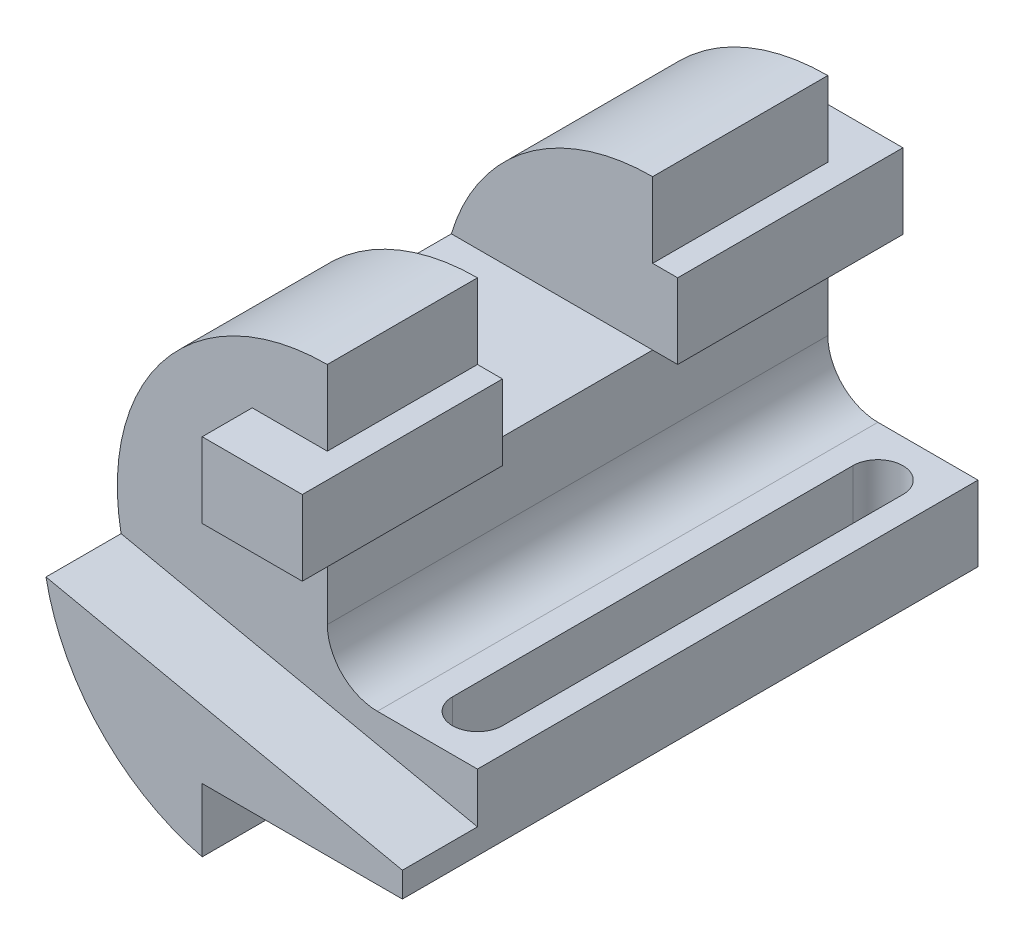
ISO-10303-21;
HEADER;
FILE_DESCRIPTION(('STEP AP214'),'2;1');
FILE_NAME('part.step','',(''),(''),'','','');
FILE_SCHEMA(('AUTOMOTIVE_DESIGN { 1 0 10303 214 1 1 1 1 }'));
ENDSEC;
DATA;
#1=APPLICATION_CONTEXT('core data for automotive mechanical design processes');
#2=APPLICATION_PROTOCOL_DEFINITION('international standard','automotive_design',2000,#1);
#3=PRODUCT_CONTEXT('',#1,'mechanical');
#4=PRODUCT('Part','Part','',(#3));
#5=PRODUCT_RELATED_PRODUCT_CATEGORY('part','',(#4));
#6=PRODUCT_DEFINITION_FORMATION('','',#4);
#7=PRODUCT_DEFINITION_CONTEXT('part definition',#1,'design');
#8=PRODUCT_DEFINITION('design','',#6,#7);
#9=PRODUCT_DEFINITION_SHAPE('','',#8);
#10=(LENGTH_UNIT() NAMED_UNIT(*) SI_UNIT(.MILLI.,.METRE.));
#11=(NAMED_UNIT(*) PLANE_ANGLE_UNIT() SI_UNIT($,.RADIAN.));
#12=(NAMED_UNIT(*) SI_UNIT($,.STERADIAN.) SOLID_ANGLE_UNIT());
#13=UNCERTAINTY_MEASURE_WITH_UNIT(LENGTH_MEASURE(1.E-05),#10,'distance_accuracy_value','');
#14=(GEOMETRIC_REPRESENTATION_CONTEXT(3) GLOBAL_UNCERTAINTY_ASSIGNED_CONTEXT((#13)) GLOBAL_UNIT_ASSIGNED_CONTEXT((#10,
#11,#12)) REPRESENTATION_CONTEXT('',''));
#15=CARTESIAN_POINT('',(0.,0.,0.));
#16=DIRECTION('',(0.,0.,1.));
#17=DIRECTION('',(1.,0.,0.));
#18=AXIS2_PLACEMENT_3D('',#15,#16,#17);
#19=CARTESIAN_POINT('',(9.99999999999992,40.7463920640612,100.));
#20=DIRECTION('',(0.,0.,1.));
#21=DIRECTION('',(1.,0.,0.));
#22=AXIS2_PLACEMENT_3D('',#19,#20,#21);
#23=PLANE('',#22);
#24=CARTESIAN_POINT('',(9.99999999999992,40.7463920640612,100.));
#25=DIRECTION('',(0.,0.,1.));
#26=DIRECTION('',(1.,0.,0.));
#27=AXIS2_PLACEMENT_3D('',#24,#25,#26);
#28=CIRCLE('',#27,41.9555534612307);
#29=CARTESIAN_POINT('',(9.99999999999992,82.7019455252919,100.));
#30=VERTEX_POINT('',#29);
#31=CARTESIAN_POINT('',(-31.2032101501895,32.8366550546839,100.));
#32=VERTEX_POINT('',#31);
#33=EDGE_CURVE('E407',#30,#32,#28,.T.);
#34=ORIENTED_EDGE('',*,*,#33,.T.);
#35=DIRECTION('',(-0.978147600733806,0.207911690817756,0.));
#36=VECTOR('',#35,1.);
#37=CARTESIAN_POINT('',(40.,17.7019455252919,100.));
#38=LINE('',#37,#36);
#39=CARTESIAN_POINT('',(40.,17.7019455252919,100.));
#40=VERTEX_POINT('',#39);
#41=EDGE_CURVE('E273',#40,#32,#38,.T.);
#42=ORIENTED_EDGE('',*,*,#41,.F.);
#43=DIRECTION('',(0.,1.,0.));
#44=VECTOR('',#43,1.);
#45=CARTESIAN_POINT('',(40.,12.7019455252919,100.));
#46=LINE('',#45,#44);
#47=CARTESIAN_POINT('',(40.,27.7019455252919,100.));
#48=VERTEX_POINT('',#47);
#49=EDGE_CURVE('E410',#40,#48,#46,.T.);
#50=ORIENTED_EDGE('',*,*,#49,.T.);
#51=DIRECTION('',(-1.,0.,0.));
#52=VECTOR('',#51,1.);
#53=CARTESIAN_POINT('',(40.,27.7019455252919,100.));
#54=LINE('',#53,#52);
#55=CARTESIAN_POINT('',(20.,27.7019455252919,100.));
#56=VERTEX_POINT('',#55);
#57=EDGE_CURVE('E414',#48,#56,#54,.T.);
#58=ORIENTED_EDGE('',*,*,#57,.T.);
#59=CARTESIAN_POINT('',(20.,37.7019455252919,100.));
#60=DIRECTION('',(0.,0.,-1.));
#61=DIRECTION('',(1.,0.,0.));
#62=AXIS2_PLACEMENT_3D('',#59,#60,#61);
#63=CIRCLE('',#62,10.);
#64=CARTESIAN_POINT('',(10.,37.7019455252919,100.));
#65=VERTEX_POINT('',#64);
#66=EDGE_CURVE('E417',#56,#65,#63,.T.);
#67=ORIENTED_EDGE('',*,*,#66,.T.);
#68=DIRECTION('',(0.,1.,0.));
#69=VECTOR('',#68,1.);
#70=CARTESIAN_POINT('',(10.,37.7019455252919,100.));
#71=LINE('',#70,#69);
#72=CARTESIAN_POINT('',(10.,52.7019455252919,100.));
#73=VERTEX_POINT('',#72);
#74=EDGE_CURVE('E420',#65,#73,#71,.T.);
#75=ORIENTED_EDGE('',*,*,#74,.T.);
#76=DIRECTION('',(1.,0.,0.));
#77=VECTOR('',#76,1.);
#78=CARTESIAN_POINT('',(14.9999999999999,52.7019455252919,100.));
#79=LINE('',#78,#77);
#80=CARTESIAN_POINT('',(-5.00000000000008,52.7019455252919,100.));
#81=VERTEX_POINT('',#80);
#82=EDGE_CURVE('E340',#81,#73,#79,.T.);
#83=ORIENTED_EDGE('',*,*,#82,.F.);
#84=DIRECTION('',(0.,-1.,0.));
#85=VECTOR('',#84,1.);
#86=CARTESIAN_POINT('',(-5.00000000000008,67.7019455252919,100.));
#87=LINE('',#86,#85);
#88=CARTESIAN_POINT('',(-5.00000000000008,67.7019455252919,100.));
#89=VERTEX_POINT('',#88);
#90=EDGE_CURVE('E334',#89,#81,#87,.T.);
#91=ORIENTED_EDGE('',*,*,#90,.F.);
#92=DIRECTION('',(-1.,0.,0.));
#93=VECTOR('',#92,1.);
#94=CARTESIAN_POINT('',(14.9999999999999,67.7019455252919,100.));
#95=LINE('',#94,#93);
#96=CARTESIAN_POINT('',(9.99999999999992,67.7019455252919,100.));
#97=VERTEX_POINT('',#96);
#98=EDGE_CURVE('E53',#97,#89,#95,.T.);
#99=ORIENTED_EDGE('',*,*,#98,.F.);
#100=DIRECTION('',(0.,1.,0.));
#101=VECTOR('',#100,1.);
#102=CARTESIAN_POINT('',(9.99999999999992,67.7019455252919,100.));
#103=LINE('',#102,#101);
#104=EDGE_CURVE('E423',#97,#30,#103,.T.);
#105=ORIENTED_EDGE('',*,*,#104,.T.);
#106=EDGE_LOOP('',(#34,#42,#50,#58,#67,#75,#83,#91,#99,#105));
#107=FACE_BOUND('',#106,.T.);
#108=ADVANCED_FACE('F43',(#107),#23,.T.);
#109=CARTESIAN_POINT('',(9.99999999999992,40.7463920640612,0.));
#110=DIRECTION('',(0.,0.,1.));
#111=DIRECTION('',(1.,0.,0.));
#112=AXIS2_PLACEMENT_3D('',#109,#110,#111);
#113=PLANE('',#112);
#114=DIRECTION('',(1.,0.,0.));
#115=VECTOR('',#114,1.);
#116=CARTESIAN_POINT('',(14.9999999999999,67.7019455252919,0.));
#117=LINE('',#116,#115);
#118=CARTESIAN_POINT('',(-5.00000000000008,67.7019455252919,0.));
#119=VERTEX_POINT('',#118);
#120=CARTESIAN_POINT('',(9.99999999999992,67.7019455252919,0.));
#121=VERTEX_POINT('',#120);
#122=EDGE_CURVE('E310',#119,#121,#117,.T.);
#123=ORIENTED_EDGE('',*,*,#122,.F.);
#124=DIRECTION('',(0.,1.,0.));
#125=VECTOR('',#124,1.);
#126=CARTESIAN_POINT('',(-5.00000000000008,67.7019455252919,0.));
#127=LINE('',#126,#125);
#128=CARTESIAN_POINT('',(-5.00000000000008,52.7019455252919,0.));
#129=VERTEX_POINT('',#128);
#130=EDGE_CURVE('E304',#129,#119,#127,.T.);
#131=ORIENTED_EDGE('',*,*,#130,.F.);
#132=DIRECTION('',(-1.,0.,0.));
#133=VECTOR('',#132,1.);
#134=CARTESIAN_POINT('',(14.9999999999999,52.7019455252919,0.));
#135=LINE('',#134,#133);
#136=CARTESIAN_POINT('',(10.,52.7019455252919,0.));
#137=VERTEX_POINT('',#136);
#138=EDGE_CURVE('E11',#137,#129,#135,.T.);
#139=ORIENTED_EDGE('',*,*,#138,.F.);
#140=DIRECTION('',(0.,1.,0.));
#141=VECTOR('',#140,1.);
#142=CARTESIAN_POINT('',(10.,37.7019455252919,0.));
#143=LINE('',#142,#141);
#144=CARTESIAN_POINT('',(10.,37.7019455252919,0.));
#145=VERTEX_POINT('',#144);
#146=EDGE_CURVE('E445',#145,#137,#143,.T.);
#147=ORIENTED_EDGE('',*,*,#146,.F.);
#148=CARTESIAN_POINT('',(20.,37.7019455252919,0.));
#149=DIRECTION('',(0.,0.,-1.));
#150=DIRECTION('',(1.,0.,0.));
#151=AXIS2_PLACEMENT_3D('',#148,#149,#150);
#152=CIRCLE('',#151,10.);
#153=CARTESIAN_POINT('',(20.,27.7019455252919,0.));
#154=VERTEX_POINT('',#153);
#155=EDGE_CURVE('E442',#154,#145,#152,.T.);
#156=ORIENTED_EDGE('',*,*,#155,.F.);
#157=DIRECTION('',(-1.,0.,0.));
#158=VECTOR('',#157,1.);
#159=CARTESIAN_POINT('',(40.,27.7019455252919,0.));
#160=LINE('',#159,#158);
#161=CARTESIAN_POINT('',(40.,27.7019455252919,0.));
#162=VERTEX_POINT('',#161);
#163=EDGE_CURVE('E439',#162,#154,#160,.T.);
#164=ORIENTED_EDGE('',*,*,#163,.F.);
#165=DIRECTION('',(0.,1.,0.));
#166=VECTOR('',#165,1.);
#167=CARTESIAN_POINT('',(40.,12.7019455252919,0.));
#168=LINE('',#167,#166);
#169=CARTESIAN_POINT('',(40.,12.7019455252919,0.));
#170=VERTEX_POINT('',#169);
#171=EDGE_CURVE('E436',#170,#162,#168,.T.);
#172=ORIENTED_EDGE('',*,*,#171,.F.);
#173=DIRECTION('',(1.,0.,0.));
#174=VECTOR('',#173,1.);
#175=CARTESIAN_POINT('',(0.,12.7019455252919,0.));
#176=LINE('',#175,#174);
#177=CARTESIAN_POINT('',(0.,12.7019455252919,0.));
#178=VERTEX_POINT('',#177);
#179=EDGE_CURVE('E433',#178,#170,#176,.T.);
#180=ORIENTED_EDGE('',*,*,#179,.F.);
#181=DIRECTION('',(0.,1.,0.));
#182=VECTOR('',#181,1.);
#183=CARTESIAN_POINT('',(0.,0.,0.));
#184=LINE('',#183,#182);
#185=CARTESIAN_POINT('',(0.,0.,0.));
#186=VERTEX_POINT('',#185);
#187=EDGE_CURVE('E430',#186,#178,#184,.T.);
#188=ORIENTED_EDGE('',*,*,#187,.F.);
#189=CARTESIAN_POINT('',(9.99999999999992,40.7463920640612,0.));
#190=DIRECTION('',(0.,0.,1.));
#191=DIRECTION('',(1.,0.,0.));
#192=AXIS2_PLACEMENT_3D('',#189,#190,#191);
#193=CIRCLE('',#192,41.9555534612307);
#194=CARTESIAN_POINT('',(9.99999999999992,82.7019455252919,0.));
#195=VERTEX_POINT('',#194);
#196=EDGE_CURVE('E406',#195,#186,#193,.T.);
#197=ORIENTED_EDGE('',*,*,#196,.F.);
#198=DIRECTION('',(0.,1.,0.));
#199=VECTOR('',#198,1.);
#200=CARTESIAN_POINT('',(9.99999999999992,67.7019455252919,0.));
#201=LINE('',#200,#199);
#202=EDGE_CURVE('E411',#121,#195,#201,.T.);
#203=ORIENTED_EDGE('',*,*,#202,.F.);
#204=EDGE_LOOP('',(#123,#131,#139,#147,#156,#164,#172,#180,#188,#197,#203));
#205=FACE_BOUND('',#204,.T.);
#206=ADVANCED_FACE('F592',(#205),#113,.F.);
#207=CARTESIAN_POINT('',(10.,52.7019455252919,100.));
#208=DIRECTION('',(0.,1.,0.));
#209=DIRECTION('',(0.,0.,1.));
#210=AXIS2_PLACEMENT_3D('',#207,#208,#209);
#211=PLANE('',#210);
#212=DIRECTION('',(0.,0.,-1.));
#213=VECTOR('',#212,1.);
#214=CARTESIAN_POINT('',(10.,52.7019455252919,100.));
#215=LINE('',#214,#213);
#216=CARTESIAN_POINT('',(10.,52.7019455252919,70.));
#217=VERTEX_POINT('',#216);
#218=EDGE_CURVE('E472',#73,#217,#215,.T.);
#219=ORIENTED_EDGE('',*,*,#218,.T.);
#220=DIRECTION('',(1.,0.,0.));
#221=VECTOR('',#220,1.);
#222=CARTESIAN_POINT('',(-31.9555534612308,52.7019455252919,70.));
#223=LINE('',#222,#221);
#224=CARTESIAN_POINT('',(14.9999999999999,52.7019455252919,70.));
#225=VERTEX_POINT('',#224);
#226=EDGE_CURVE('E373',#217,#225,#223,.T.);
#227=ORIENTED_EDGE('',*,*,#226,.T.);
#228=DIRECTION('',(0.,0.,-1.));
#229=VECTOR('',#228,1.);
#230=CARTESIAN_POINT('',(14.9999999999999,52.7019455252919,100.));
#231=LINE('',#230,#229);
#232=CARTESIAN_POINT('',(14.9999999999999,52.7019455252919,110.));
#233=VERTEX_POINT('',#232);
#234=EDGE_CURVE('E467',#233,#225,#231,.T.);
#235=ORIENTED_EDGE('',*,*,#234,.F.);
#236=DIRECTION('',(1.,0.,0.));
#237=VECTOR('',#236,1.);
#238=CARTESIAN_POINT('',(14.9999999999999,52.7019455252919,110.));
#239=LINE('',#238,#237);
#240=CARTESIAN_POINT('',(-5.00000000000008,52.7019455252919,110.));
#241=VERTEX_POINT('',#240);
#242=EDGE_CURVE('E346',#241,#233,#239,.T.);
#243=ORIENTED_EDGE('',*,*,#242,.F.);
#244=DIRECTION('',(0.,0.,-1.));
#245=VECTOR('',#244,1.);
#246=CARTESIAN_POINT('',(-5.00000000000008,52.7019455252919,110.));
#247=LINE('',#246,#245);
#248=EDGE_CURVE('E350',#241,#81,#247,.T.);
#249=ORIENTED_EDGE('',*,*,#248,.T.);
#250=ORIENTED_EDGE('',*,*,#82,.T.);
#251=EDGE_LOOP('',(#219,#227,#235,#243,#249,#250));
#252=FACE_BOUND('',#251,.T.);
#253=ADVANCED_FACE('F546',(#252),#211,.F.);
#254=CARTESIAN_POINT('',(14.9999999999999,52.7019455252919,100.));
#255=DIRECTION('',(-1.,0.,0.));
#256=DIRECTION('',(0.,-1.,0.));
#257=AXIS2_PLACEMENT_3D('',#254,#255,#256);
#258=PLANE('',#257);
#259=ORIENTED_EDGE('',*,*,#234,.T.);
#260=DIRECTION('',(0.,-1.,0.));
#261=VECTOR('',#260,1.);
#262=CARTESIAN_POINT('',(14.9999999999999,82.7019455252919,70.));
#263=LINE('',#262,#261);
#264=CARTESIAN_POINT('',(14.9999999999999,67.7019455252919,70.));
#265=VERTEX_POINT('',#264);
#266=EDGE_CURVE('E367',#265,#225,#263,.T.);
#267=ORIENTED_EDGE('',*,*,#266,.F.);
#268=DIRECTION('',(0.,0.,-1.));
#269=VECTOR('',#268,1.);
#270=CARTESIAN_POINT('',(14.9999999999999,67.7019455252919,100.));
#271=LINE('',#270,#269);
#272=CARTESIAN_POINT('',(14.9999999999999,67.7019455252919,110.));
#273=VERTEX_POINT('',#272);
#274=EDGE_CURVE('E462',#273,#265,#271,.T.);
#275=ORIENTED_EDGE('',*,*,#274,.F.);
#276=DIRECTION('',(0.,1.,0.));
#277=VECTOR('',#276,1.);
#278=CARTESIAN_POINT('',(14.9999999999999,67.7019455252919,110.));
#279=LINE('',#278,#277);
#280=EDGE_CURVE('E335',#233,#273,#279,.T.);
#281=ORIENTED_EDGE('',*,*,#280,.F.);
#282=EDGE_LOOP('',(#259,#267,#275,#281));
#283=FACE_BOUND('',#282,.T.);
#284=ADVANCED_FACE('F551',(#283),#258,.F.);
#285=CARTESIAN_POINT('',(14.9999999999999,67.7019455252919,100.));
#286=DIRECTION('',(0.,-1.,0.));
#287=DIRECTION('',(0.,0.,-1.));
#288=AXIS2_PLACEMENT_3D('',#285,#286,#287);
#289=PLANE('',#288);
#290=ORIENTED_EDGE('',*,*,#274,.T.);
#291=DIRECTION('',(-1.,0.,0.));
#292=VECTOR('',#291,1.);
#293=CARTESIAN_POINT('',(14.9999999999999,67.7019455252919,70.));
#294=LINE('',#293,#292);
#295=CARTESIAN_POINT('',(9.99999999999992,67.7019455252919,70.));
#296=VERTEX_POINT('',#295);
#297=EDGE_CURVE('E390',#265,#296,#294,.T.);
#298=ORIENTED_EDGE('',*,*,#297,.T.);
#299=DIRECTION('',(0.,0.,-1.));
#300=VECTOR('',#299,1.);
#301=CARTESIAN_POINT('',(9.99999999999992,67.7019455252919,100.));
#302=LINE('',#301,#300);
#303=EDGE_CURVE('E457',#97,#296,#302,.T.);
#304=ORIENTED_EDGE('',*,*,#303,.F.);
#305=ORIENTED_EDGE('',*,*,#98,.T.);
#306=DIRECTION('',(0.,0.,-1.));
#307=VECTOR('',#306,1.);
#308=CARTESIAN_POINT('',(-5.00000000000008,67.7019455252919,110.));
#309=LINE('',#308,#307);
#310=CARTESIAN_POINT('',(-5.00000000000008,67.7019455252919,110.));
#311=VERTEX_POINT('',#310);
#312=EDGE_CURVE('E363',#311,#89,#309,.T.);
#313=ORIENTED_EDGE('',*,*,#312,.F.);
#314=DIRECTION('',(-1.,0.,0.));
#315=VECTOR('',#314,1.);
#316=CARTESIAN_POINT('',(14.9999999999999,67.7019455252919,110.));
#317=LINE('',#316,#315);
#318=EDGE_CURVE('E339',#273,#311,#317,.T.);
#319=ORIENTED_EDGE('',*,*,#318,.F.);
#320=EDGE_LOOP('',(#290,#298,#304,#305,#313,#319));
#321=FACE_BOUND('',#320,.T.);
#322=ADVANCED_FACE('F555',(#321),#289,.F.);
#323=CARTESIAN_POINT('',(9.99999999999992,67.7019455252919,100.));
#324=DIRECTION('',(-1.,0.,0.));
#325=DIRECTION('',(0.,0.,1.));
#326=AXIS2_PLACEMENT_3D('',#323,#324,#325);
#327=PLANE('',#326);
#328=ORIENTED_EDGE('',*,*,#303,.T.);
#329=DIRECTION('',(0.,1.,0.));
#330=VECTOR('',#329,1.);
#331=CARTESIAN_POINT('',(9.99999999999992,67.7019455252919,70.));
#332=LINE('',#331,#330);
#333=CARTESIAN_POINT('',(9.99999999999993,82.7019455252919,70.));
#334=VERTEX_POINT('',#333);
#335=EDGE_CURVE('E47',#296,#334,#332,.T.);
#336=ORIENTED_EDGE('',*,*,#335,.T.);
#337=DIRECTION('',(0.,0.,-1.));
#338=VECTOR('',#337,1.);
#339=CARTESIAN_POINT('',(9.99999999999992,82.7019455252919,100.));
#340=LINE('',#339,#338);
#341=EDGE_CURVE('E452',#30,#334,#340,.T.);
#342=ORIENTED_EDGE('',*,*,#341,.F.);
#343=ORIENTED_EDGE('',*,*,#104,.F.);
#344=EDGE_LOOP('',(#328,#336,#342,#343));
#345=FACE_BOUND('',#344,.T.);
#346=ADVANCED_FACE('F509',(#345),#327,.F.);
#347=CARTESIAN_POINT('',(9.99999999999992,40.7463920640612,100.));
#348=DIRECTION('',(0.,0.,-1.));
#349=DIRECTION('',(-1.,0.,0.));
#350=AXIS2_PLACEMENT_3D('',#347,#348,#349);
#351=CYLINDRICAL_SURFACE('',#350,41.9555534612307);
#352=ORIENTED_EDGE('',*,*,#341,.T.);
#353=CARTESIAN_POINT('',(9.99999999999992,40.7463920640612,70.));
#354=DIRECTION('',(0.,0.,1.));
#355=DIRECTION('',(1.,0.,0.));
#356=AXIS2_PLACEMENT_3D('',#353,#354,#355);
#357=CIRCLE('',#356,41.9555534612307);
#358=CARTESIAN_POINT('',(-30.2160814559779,52.7019455252919,70.));
#359=VERTEX_POINT('',#358);
#360=EDGE_CURVE('E394',#334,#359,#357,.T.);
#361=ORIENTED_EDGE('',*,*,#360,.T.);
#362=DIRECTION('',(0.,0.,-1.));
#363=VECTOR('',#362,1.);
#364=CARTESIAN_POINT('',(-30.2160814559779,52.7019455252919,100.));
#365=LINE('',#364,#363);
#366=CARTESIAN_POINT('',(-30.2160814559779,52.7019455252919,35.));
#367=VERTEX_POINT('',#366);
#368=EDGE_CURVE('E402',#359,#367,#365,.T.);
#369=ORIENTED_EDGE('',*,*,#368,.T.);
#370=CARTESIAN_POINT('',(9.99999999999992,40.7463920640612,35.));
#371=DIRECTION('',(0.,0.,-1.));
#372=DIRECTION('',(-1.,0.,0.));
#373=AXIS2_PLACEMENT_3D('',#370,#371,#372);
#374=CIRCLE('',#373,41.9555534612307);
#375=CARTESIAN_POINT('',(9.99999999999993,82.7019455252919,35.));
#376=VERTEX_POINT('',#375);
#377=EDGE_CURVE('E386',#367,#376,#374,.T.);
#378=ORIENTED_EDGE('',*,*,#377,.T.);
#379=EDGE_CURVE('E426',#376,#195,#340,.T.);
#380=ORIENTED_EDGE('',*,*,#379,.T.);
#381=ORIENTED_EDGE('',*,*,#196,.T.);
#382=DIRECTION('',(0.,0.,-1.));
#383=VECTOR('',#382,1.);
#384=CARTESIAN_POINT('',(0.,0.,100.));
#385=LINE('',#384,#383);
#386=CARTESIAN_POINT('',(0.,0.,115.));
#387=VERTEX_POINT('',#386);
#388=EDGE_CURVE('E496',#387,#186,#385,.T.);
#389=ORIENTED_EDGE('',*,*,#388,.F.);
#390=CARTESIAN_POINT('',(10.0000000000009,40.7463920640621,115.));
#391=DIRECTION('',(0.,0.,1.));
#392=DIRECTION('',(1.,0.,0.));
#393=AXIS2_PLACEMENT_3D('',#390,#391,#392);
#394=CIRCLE('',#393,41.9555534612318);
#395=CARTESIAN_POINT('',(-31.2032101501895,32.8366550546839,115.));
#396=VERTEX_POINT('',#395);
#397=EDGE_CURVE('E281',#396,#387,#394,.T.);
#398=ORIENTED_EDGE('',*,*,#397,.F.);
#399=DIRECTION('',(0.,0.,-1.));
#400=VECTOR('',#399,1.);
#401=CARTESIAN_POINT('',(-31.2032101501895,32.8366550546839,115.));
#402=LINE('',#401,#400);
#403=EDGE_CURVE('E293',#396,#32,#402,.T.);
#404=ORIENTED_EDGE('',*,*,#403,.T.);
#405=ORIENTED_EDGE('',*,*,#33,.F.);
#406=EDGE_LOOP('',(#352,#361,#369,#378,#380,#381,#389,#398,#404,#405));
#407=FACE_BOUND('',#406,.T.);
#408=ADVANCED_FACE('F45',(#407),#351,.T.);
#409=CARTESIAN_POINT('',(0.,0.,100.));
#410=DIRECTION('',(-1.,0.,0.));
#411=DIRECTION('',(0.,0.,1.));
#412=AXIS2_PLACEMENT_3D('',#409,#410,#411);
#413=PLANE('',#412);
#414=ORIENTED_EDGE('',*,*,#187,.T.);
#415=DIRECTION('',(0.,0.,-1.));
#416=VECTOR('',#415,1.);
#417=CARTESIAN_POINT('',(0.,12.7019455252919,100.));
#418=LINE('',#417,#416);
#419=CARTESIAN_POINT('',(0.,12.7019455252919,115.));
#420=VERTEX_POINT('',#419);
#421=EDGE_CURVE('E492',#420,#178,#418,.T.);
#422=ORIENTED_EDGE('',*,*,#421,.F.);
#423=DIRECTION('',(0.,1.,0.));
#424=VECTOR('',#423,1.);
#425=CARTESIAN_POINT('',(0.,12.7019455252919,115.));
#426=LINE('',#425,#424);
#427=EDGE_CURVE('E285',#387,#420,#426,.T.);
#428=ORIENTED_EDGE('',*,*,#427,.F.);
#429=ORIENTED_EDGE('',*,*,#388,.T.);
#430=EDGE_LOOP('',(#414,#422,#428,#429));
#431=FACE_BOUND('',#430,.T.);
#432=ADVANCED_FACE('F599',(#431),#413,.F.);
#433=CARTESIAN_POINT('',(0.,12.7019455252919,100.));
#434=DIRECTION('',(0.,1.,0.));
#435=DIRECTION('',(0.,0.,1.));
#436=AXIS2_PLACEMENT_3D('',#433,#434,#435);
#437=PLANE('',#436);
#438=DIRECTION('',(0.,0.,-1.));
#439=VECTOR('',#438,1.);
#440=CARTESIAN_POINT('',(35.,12.7019455252919,100.));
#441=LINE('',#440,#439);
#442=CARTESIAN_POINT('',(35.,12.7019455252919,90.));
#443=VERTEX_POINT('',#442);
#444=CARTESIAN_POINT('',(35.,12.7019455252919,9.99999999999999));
#445=VERTEX_POINT('',#444);
#446=EDGE_CURVE('E265',#443,#445,#441,.T.);
#447=ORIENTED_EDGE('',*,*,#446,.T.);
#448=CARTESIAN_POINT('',(30.,12.7019455252919,9.99999999999999));
#449=DIRECTION('',(0.,1.,0.));
#450=DIRECTION('',(0.,0.,1.));
#451=AXIS2_PLACEMENT_3D('',#448,#449,#450);
#452=CIRCLE('',#451,5.);
#453=CARTESIAN_POINT('',(25.,12.7019455252919,10.));
#454=VERTEX_POINT('',#453);
#455=EDGE_CURVE('E269',#445,#454,#452,.T.);
#456=ORIENTED_EDGE('',*,*,#455,.T.);
#457=DIRECTION('',(0.,0.,1.));
#458=VECTOR('',#457,1.);
#459=CARTESIAN_POINT('',(25.,12.7019455252919,100.));
#460=LINE('',#459,#458);
#461=CARTESIAN_POINT('',(25.,12.7019455252919,90.));
#462=VERTEX_POINT('',#461);
#463=EDGE_CURVE('E256',#454,#462,#460,.T.);
#464=ORIENTED_EDGE('',*,*,#463,.T.);
#465=CARTESIAN_POINT('',(30.,12.7019455252919,90.));
#466=DIRECTION('',(0.,1.,0.));
#467=DIRECTION('',(0.,0.,1.));
#468=AXIS2_PLACEMENT_3D('',#465,#466,#467);
#469=CIRCLE('',#468,5.);
#470=EDGE_CURVE('E231',#462,#443,#469,.T.);
#471=ORIENTED_EDGE('',*,*,#470,.T.);
#472=EDGE_LOOP('',(#447,#456,#464,#471));
#473=FACE_BOUND('',#472,.T.);
#474=ORIENTED_EDGE('',*,*,#179,.T.);
#475=DIRECTION('',(0.,0.,-1.));
#476=VECTOR('',#475,1.);
#477=CARTESIAN_POINT('',(40.,12.7019455252919,100.));
#478=LINE('',#477,#476);
#479=CARTESIAN_POINT('',(40.,12.7019455252919,115.));
#480=VERTEX_POINT('',#479);
#481=EDGE_CURVE('E488',#480,#170,#478,.T.);
#482=ORIENTED_EDGE('',*,*,#481,.F.);
#483=DIRECTION('',(1.,0.,0.));
#484=VECTOR('',#483,1.);
#485=CARTESIAN_POINT('',(40.,12.7019455252919,115.));
#486=LINE('',#485,#484);
#487=EDGE_CURVE('E289',#420,#480,#486,.T.);
#488=ORIENTED_EDGE('',*,*,#487,.F.);
#489=ORIENTED_EDGE('',*,*,#421,.T.);
#490=EDGE_LOOP('',(#474,#482,#488,#489));
#491=FACE_BOUND('',#490,.T.);
#492=ADVANCED_FACE('F601',(#473,#491),#437,.F.);
#493=CARTESIAN_POINT('',(40.,12.7019455252919,100.));
#494=DIRECTION('',(-1.,0.,0.));
#495=DIRECTION('',(0.,-1.,0.));
#496=AXIS2_PLACEMENT_3D('',#493,#494,#495);
#497=PLANE('',#496);
#498=ORIENTED_EDGE('',*,*,#171,.T.);
#499=DIRECTION('',(0.,0.,-1.));
#500=VECTOR('',#499,1.);
#501=CARTESIAN_POINT('',(40.,27.7019455252919,100.));
#502=LINE('',#501,#500);
#503=EDGE_CURVE('E484',#48,#162,#502,.T.);
#504=ORIENTED_EDGE('',*,*,#503,.F.);
#505=ORIENTED_EDGE('',*,*,#49,.F.);
#506=DIRECTION('',(0.,0.,-1.));
#507=VECTOR('',#506,1.);
#508=CARTESIAN_POINT('',(40.,17.7019455252919,115.));
#509=LINE('',#508,#507);
#510=CARTESIAN_POINT('',(40.,17.7019455252919,115.));
#511=VERTEX_POINT('',#510);
#512=EDGE_CURVE('E300',#511,#40,#509,.T.);
#513=ORIENTED_EDGE('',*,*,#512,.F.);
#514=DIRECTION('',(0.,1.,0.));
#515=VECTOR('',#514,1.);
#516=CARTESIAN_POINT('',(40.,17.7019455252919,115.));
#517=LINE('',#516,#515);
#518=EDGE_CURVE('E274',#480,#511,#517,.T.);
#519=ORIENTED_EDGE('',*,*,#518,.F.);
#520=ORIENTED_EDGE('',*,*,#481,.T.);
#521=EDGE_LOOP('',(#498,#504,#505,#513,#519,#520));
#522=FACE_BOUND('',#521,.T.);
#523=ADVANCED_FACE('F524',(#522),#497,.F.);
#524=CARTESIAN_POINT('',(40.,27.7019455252919,100.));
#525=DIRECTION('',(0.,-1.,0.));
#526=DIRECTION('',(1.,0.,0.));
#527=AXIS2_PLACEMENT_3D('',#524,#525,#526);
#528=PLANE('',#527);
#529=DIRECTION('',(0.,0.,1.));
#530=VECTOR('',#529,1.);
#531=CARTESIAN_POINT('',(25.,27.7019455252919,10.));
#532=LINE('',#531,#530);
#533=CARTESIAN_POINT('',(25.,27.7019455252919,9.99999999999999));
#534=VERTEX_POINT('',#533);
#535=CARTESIAN_POINT('',(25.,27.7019455252919,90.));
#536=VERTEX_POINT('',#535);
#537=EDGE_CURVE('E238',#534,#536,#532,.T.);
#538=ORIENTED_EDGE('',*,*,#537,.F.);
#539=CARTESIAN_POINT('',(30.,27.7019455252919,9.99999999999999));
#540=DIRECTION('',(0.,1.,0.));
#541=DIRECTION('',(-1.,0.,0.));
#542=AXIS2_PLACEMENT_3D('',#539,#540,#541);
#543=CIRCLE('',#542,5.);
#544=CARTESIAN_POINT('',(35.,27.7019455252919,9.99999999999999));
#545=VERTEX_POINT('',#544);
#546=EDGE_CURVE('E69',#545,#534,#543,.T.);
#547=ORIENTED_EDGE('',*,*,#546,.F.);
#548=DIRECTION('',(0.,0.,-1.));
#549=VECTOR('',#548,1.);
#550=CARTESIAN_POINT('',(35.,27.7019455252919,9.99999999999999));
#551=LINE('',#550,#549);
#552=CARTESIAN_POINT('',(35.,27.7019455252919,90.));
#553=VERTEX_POINT('',#552);
#554=EDGE_CURVE('E246',#553,#545,#551,.T.);
#555=ORIENTED_EDGE('',*,*,#554,.F.);
#556=CARTESIAN_POINT('',(30.,27.7019455252919,90.));
#557=DIRECTION('',(0.,1.,0.));
#558=DIRECTION('',(-1.,0.,0.));
#559=AXIS2_PLACEMENT_3D('',#556,#557,#558);
#560=CIRCLE('',#559,5.);
#561=EDGE_CURVE('E228',#536,#553,#560,.T.);
#562=ORIENTED_EDGE('',*,*,#561,.F.);
#563=EDGE_LOOP('',(#538,#547,#555,#562));
#564=FACE_BOUND('',#563,.T.);
#565=ORIENTED_EDGE('',*,*,#163,.T.);
#566=DIRECTION('',(0.,0.,-1.));
#567=VECTOR('',#566,1.);
#568=CARTESIAN_POINT('',(20.,27.7019455252919,100.));
#569=LINE('',#568,#567);
#570=EDGE_CURVE('E480',#56,#154,#569,.T.);
#571=ORIENTED_EDGE('',*,*,#570,.F.);
#572=ORIENTED_EDGE('',*,*,#57,.F.);
#573=ORIENTED_EDGE('',*,*,#503,.T.);
#574=EDGE_LOOP('',(#565,#571,#572,#573));
#575=FACE_BOUND('',#574,.T.);
#576=ADVANCED_FACE('F243',(#564,#575),#528,.F.);
#577=CARTESIAN_POINT('',(20.,37.7019455252919,100.));
#578=DIRECTION('',(0.,0.,-1.));
#579=DIRECTION('',(-1.,0.,0.));
#580=AXIS2_PLACEMENT_3D('',#577,#578,#579);
#581=CYLINDRICAL_SURFACE('',#580,10.);
#582=ORIENTED_EDGE('',*,*,#155,.T.);
#583=DIRECTION('',(0.,0.,-1.));
#584=VECTOR('',#583,1.);
#585=CARTESIAN_POINT('',(10.,37.7019455252919,100.));
#586=LINE('',#585,#584);
#587=EDGE_CURVE('E476',#65,#145,#586,.T.);
#588=ORIENTED_EDGE('',*,*,#587,.F.);
#589=ORIENTED_EDGE('',*,*,#66,.F.);
#590=ORIENTED_EDGE('',*,*,#570,.T.);
#591=EDGE_LOOP('',(#582,#588,#589,#590));
#592=FACE_BOUND('',#591,.T.);
#593=ADVANCED_FACE('F533',(#592),#581,.F.);
#594=CARTESIAN_POINT('',(10.,37.7019455252919,100.));
#595=DIRECTION('',(-1.,0.,0.));
#596=DIRECTION('',(0.,-1.,0.));
#597=AXIS2_PLACEMENT_3D('',#594,#595,#596);
#598=PLANE('',#597);
#599=ORIENTED_EDGE('',*,*,#146,.T.);
#600=CARTESIAN_POINT('',(10.,52.7019455252919,35.));
#601=VERTEX_POINT('',#600);
#602=EDGE_CURVE('E471',#601,#137,#215,.T.);
#603=ORIENTED_EDGE('',*,*,#602,.F.);
#604=DIRECTION('',(0.,0.,1.));
#605=VECTOR('',#604,1.);
#606=CARTESIAN_POINT('',(10.,52.7019455252919,100.));
#607=LINE('',#606,#605);
#608=EDGE_CURVE('E398',#601,#217,#607,.T.);
#609=ORIENTED_EDGE('',*,*,#608,.T.);
#610=ORIENTED_EDGE('',*,*,#218,.F.);
#611=ORIENTED_EDGE('',*,*,#74,.F.);
#612=ORIENTED_EDGE('',*,*,#587,.T.);
#613=EDGE_LOOP('',(#599,#603,#609,#610,#611,#612));
#614=FACE_BOUND('',#613,.T.);
#615=ADVANCED_FACE('F538',(#614),#598,.F.);
#616=CARTESIAN_POINT('',(14.9999999999999,52.7019455252919,35.));
#617=VERTEX_POINT('',#616);
#618=CARTESIAN_POINT('',(14.9999999999999,52.7019455252919,-10.));
#619=VERTEX_POINT('',#618);
#620=EDGE_CURVE('E466',#617,#619,#231,.T.);
#621=ORIENTED_EDGE('',*,*,#620,.F.);
#622=DIRECTION('',(1.,0.,0.));
#623=VECTOR('',#622,1.);
#624=CARTESIAN_POINT('',(-31.9555534612308,52.7019455252919,35.));
#625=LINE('',#624,#623);
#626=EDGE_CURVE('E374',#601,#617,#625,.T.);
#627=ORIENTED_EDGE('',*,*,#626,.F.);
#628=ORIENTED_EDGE('',*,*,#602,.T.);
#629=ORIENTED_EDGE('',*,*,#138,.T.);
#630=DIRECTION('',(0.,0.,1.));
#631=VECTOR('',#630,1.);
#632=CARTESIAN_POINT('',(-5.00000000000008,52.7019455252919,-10.));
#633=LINE('',#632,#631);
#634=CARTESIAN_POINT('',(-5.00000000000008,52.7019455252919,-10.));
#635=VERTEX_POINT('',#634);
#636=EDGE_CURVE('E330',#635,#129,#633,.T.);
#637=ORIENTED_EDGE('',*,*,#636,.F.);
#638=DIRECTION('',(-1.,0.,0.));
#639=VECTOR('',#638,1.);
#640=CARTESIAN_POINT('',(14.9999999999999,52.7019455252919,-10.));
#641=LINE('',#640,#639);
#642=EDGE_CURVE('E309',#619,#635,#641,.T.);
#643=ORIENTED_EDGE('',*,*,#642,.F.);
#644=EDGE_LOOP('',(#621,#627,#628,#629,#637,#643));
#645=FACE_BOUND('',#644,.T.);
#646=ADVANCED_FACE('F578',(#645),#211,.F.);
#647=CARTESIAN_POINT('',(14.9999999999999,67.7019455252919,35.));
#648=VERTEX_POINT('',#647);
#649=CARTESIAN_POINT('',(14.9999999999999,67.7019455252919,-10.));
#650=VERTEX_POINT('',#649);
#651=EDGE_CURVE('E461',#648,#650,#271,.T.);
#652=ORIENTED_EDGE('',*,*,#651,.F.);
#653=DIRECTION('',(0.,1.,0.));
#654=VECTOR('',#653,1.);
#655=CARTESIAN_POINT('',(14.9999999999999,82.7019455252919,35.));
#656=LINE('',#655,#654);
#657=EDGE_CURVE('E370',#617,#648,#656,.T.);
#658=ORIENTED_EDGE('',*,*,#657,.F.);
#659=ORIENTED_EDGE('',*,*,#620,.T.);
#660=DIRECTION('',(0.,-1.,0.));
#661=VECTOR('',#660,1.);
#662=CARTESIAN_POINT('',(14.9999999999999,67.7019455252919,-10.));
#663=LINE('',#662,#661);
#664=EDGE_CURVE('E305',#650,#619,#663,.T.);
#665=ORIENTED_EDGE('',*,*,#664,.F.);
#666=EDGE_LOOP('',(#652,#658,#659,#665));
#667=FACE_BOUND('',#666,.T.);
#668=ADVANCED_FACE('F584',(#667),#258,.F.);
#669=CARTESIAN_POINT('',(9.99999999999992,67.7019455252919,35.));
#670=VERTEX_POINT('',#669);
#671=EDGE_CURVE('E456',#670,#121,#302,.T.);
#672=ORIENTED_EDGE('',*,*,#671,.F.);
#673=DIRECTION('',(1.,0.,0.));
#674=VECTOR('',#673,1.);
#675=CARTESIAN_POINT('',(14.9999999999999,67.7019455252919,35.));
#676=LINE('',#675,#674);
#677=EDGE_CURVE('E382',#670,#648,#676,.T.);
#678=ORIENTED_EDGE('',*,*,#677,.T.);
#679=ORIENTED_EDGE('',*,*,#651,.T.);
#680=DIRECTION('',(1.,0.,0.));
#681=VECTOR('',#680,1.);
#682=CARTESIAN_POINT('',(14.9999999999999,67.7019455252919,-10.));
#683=LINE('',#682,#681);
#684=CARTESIAN_POINT('',(-5.00000000000008,67.7019455252919,-10.));
#685=VERTEX_POINT('',#684);
#686=EDGE_CURVE('E316',#685,#650,#683,.T.);
#687=ORIENTED_EDGE('',*,*,#686,.F.);
#688=DIRECTION('',(0.,0.,1.));
#689=VECTOR('',#688,1.);
#690=CARTESIAN_POINT('',(-5.00000000000008,67.7019455252919,-10.));
#691=LINE('',#690,#689);
#692=EDGE_CURVE('E319',#685,#119,#691,.T.);
#693=ORIENTED_EDGE('',*,*,#692,.T.);
#694=ORIENTED_EDGE('',*,*,#122,.T.);
#695=EDGE_LOOP('',(#672,#678,#679,#687,#693,#694));
#696=FACE_BOUND('',#695,.T.);
#697=ADVANCED_FACE('F586',(#696),#289,.F.);
#698=ORIENTED_EDGE('',*,*,#379,.F.);
#699=DIRECTION('',(0.,-1.,0.));
#700=VECTOR('',#699,1.);
#701=CARTESIAN_POINT('',(9.99999999999992,67.7019455252919,35.));
#702=LINE('',#701,#700);
#703=EDGE_CURVE('E499',#376,#670,#702,.T.);
#704=ORIENTED_EDGE('',*,*,#703,.T.);
#705=ORIENTED_EDGE('',*,*,#671,.T.);
#706=ORIENTED_EDGE('',*,*,#202,.T.);
#707=EDGE_LOOP('',(#698,#704,#705,#706));
#708=FACE_BOUND('',#707,.T.);
#709=ADVANCED_FACE('F589',(#708),#327,.F.);
#710=CARTESIAN_POINT('',(-31.9555534612308,52.7019455252919,70.));
#711=DIRECTION('',(0.,-1.,0.));
#712=DIRECTION('',(1.,0.,0.));
#713=AXIS2_PLACEMENT_3D('',#710,#711,#712);
#714=PLANE('',#713);
#715=EDGE_CURVE('E378',#359,#217,#223,.T.);
#716=ORIENTED_EDGE('',*,*,#715,.T.);
#717=ORIENTED_EDGE('',*,*,#608,.F.);
#718=EDGE_CURVE('E377',#367,#601,#625,.T.);
#719=ORIENTED_EDGE('',*,*,#718,.F.);
#720=ORIENTED_EDGE('',*,*,#368,.F.);
#721=EDGE_LOOP('',(#716,#717,#719,#720));
#722=FACE_BOUND('',#721,.T.);
#723=ADVANCED_FACE('F560',(#722),#714,.F.);
#724=CARTESIAN_POINT('',(-31.9555534612308,82.7019455252919,70.));
#725=DIRECTION('',(0.,0.,1.));
#726=DIRECTION('',(1.,0.,0.));
#727=AXIS2_PLACEMENT_3D('',#724,#725,#726);
#728=PLANE('',#727);
#729=ORIENTED_EDGE('',*,*,#335,.F.);
#730=ORIENTED_EDGE('',*,*,#297,.F.);
#731=ORIENTED_EDGE('',*,*,#266,.T.);
#732=ORIENTED_EDGE('',*,*,#226,.F.);
#733=ORIENTED_EDGE('',*,*,#715,.F.);
#734=ORIENTED_EDGE('',*,*,#360,.F.);
#735=EDGE_LOOP('',(#729,#730,#731,#732,#733,#734));
#736=FACE_BOUND('',#735,.T.);
#737=ADVANCED_FACE('F556',(#736),#728,.F.);
#738=CARTESIAN_POINT('',(-31.9555534612308,82.7019455252919,35.));
#739=DIRECTION('',(0.,0.,-1.));
#740=DIRECTION('',(-1.,0.,0.));
#741=AXIS2_PLACEMENT_3D('',#738,#739,#740);
#742=PLANE('',#741);
#743=ORIENTED_EDGE('',*,*,#718,.T.);
#744=ORIENTED_EDGE('',*,*,#626,.T.);
#745=ORIENTED_EDGE('',*,*,#657,.T.);
#746=ORIENTED_EDGE('',*,*,#677,.F.);
#747=ORIENTED_EDGE('',*,*,#703,.F.);
#748=ORIENTED_EDGE('',*,*,#377,.F.);
#749=EDGE_LOOP('',(#743,#744,#745,#746,#747,#748));
#750=FACE_BOUND('',#749,.T.);
#751=ADVANCED_FACE('F575',(#750),#742,.F.);
#752=CARTESIAN_POINT('',(-5.00000000000008,67.7019455252919,110.));
#753=DIRECTION('',(1.,0.,0.));
#754=DIRECTION('',(0.,1.,0.));
#755=AXIS2_PLACEMENT_3D('',#752,#753,#754);
#756=PLANE('',#755);
#757=ORIENTED_EDGE('',*,*,#90,.T.);
#758=ORIENTED_EDGE('',*,*,#248,.F.);
#759=DIRECTION('',(0.,-1.,0.));
#760=VECTOR('',#759,1.);
#761=CARTESIAN_POINT('',(-5.00000000000008,67.7019455252919,110.));
#762=LINE('',#761,#760);
#763=EDGE_CURVE('E343',#311,#241,#762,.T.);
#764=ORIENTED_EDGE('',*,*,#763,.F.);
#765=ORIENTED_EDGE('',*,*,#312,.T.);
#766=EDGE_LOOP('',(#757,#758,#764,#765));
#767=FACE_BOUND('',#766,.T.);
#768=ADVANCED_FACE('F542',(#767),#756,.F.);
#769=CARTESIAN_POINT('',(0.,0.,110.));
#770=DIRECTION('',(0.,0.,-1.));
#771=DIRECTION('',(-1.,0.,0.));
#772=AXIS2_PLACEMENT_3D('',#769,#770,#771);
#773=PLANE('',#772);
#774=ORIENTED_EDGE('',*,*,#280,.T.);
#775=ORIENTED_EDGE('',*,*,#318,.T.);
#776=ORIENTED_EDGE('',*,*,#763,.T.);
#777=ORIENTED_EDGE('',*,*,#242,.T.);
#778=EDGE_LOOP('',(#774,#775,#776,#777));
#779=FACE_BOUND('',#778,.T.);
#780=ADVANCED_FACE('F549',(#779),#773,.F.);
#781=CARTESIAN_POINT('',(-5.00000000000008,67.7019455252919,-10.));
#782=DIRECTION('',(1.,0.,0.));
#783=DIRECTION('',(0.,1.,0.));
#784=AXIS2_PLACEMENT_3D('',#781,#782,#783);
#785=PLANE('',#784);
#786=ORIENTED_EDGE('',*,*,#130,.T.);
#787=ORIENTED_EDGE('',*,*,#692,.F.);
#788=DIRECTION('',(0.,1.,0.));
#789=VECTOR('',#788,1.);
#790=CARTESIAN_POINT('',(-5.00000000000008,67.7019455252919,-10.));
#791=LINE('',#790,#789);
#792=EDGE_CURVE('E313',#635,#685,#791,.T.);
#793=ORIENTED_EDGE('',*,*,#792,.F.);
#794=ORIENTED_EDGE('',*,*,#636,.T.);
#795=EDGE_LOOP('',(#786,#787,#793,#794));
#796=FACE_BOUND('',#795,.T.);
#797=ADVANCED_FACE('F605',(#796),#785,.F.);
#798=CARTESIAN_POINT('',(0.,0.,-10.));
#799=DIRECTION('',(0.,0.,-1.));
#800=DIRECTION('',(-1.,0.,0.));
#801=AXIS2_PLACEMENT_3D('',#798,#799,#800);
#802=PLANE('',#801);
#803=ORIENTED_EDGE('',*,*,#664,.T.);
#804=ORIENTED_EDGE('',*,*,#642,.T.);
#805=ORIENTED_EDGE('',*,*,#792,.T.);
#806=ORIENTED_EDGE('',*,*,#686,.T.);
#807=EDGE_LOOP('',(#803,#804,#805,#806));
#808=FACE_BOUND('',#807,.T.);
#809=ADVANCED_FACE('F608',(#808),#802,.T.);
#810=CARTESIAN_POINT('',(40.,17.7019455252919,115.));
#811=DIRECTION('',(-0.207911690817756,-0.978147600733806,0.));
#812=DIRECTION('',(0.978147600733806,-0.207911690817756,0.));
#813=AXIS2_PLACEMENT_3D('',#810,#811,#812);
#814=PLANE('',#813);
#815=ORIENTED_EDGE('',*,*,#41,.T.);
#816=ORIENTED_EDGE('',*,*,#403,.F.);
#817=DIRECTION('',(-0.978147600733806,0.207911690817756,0.));
#818=VECTOR('',#817,1.);
#819=CARTESIAN_POINT('',(40.,17.7019455252919,115.));
#820=LINE('',#819,#818);
#821=EDGE_CURVE('E278',#511,#396,#820,.T.);
#822=ORIENTED_EDGE('',*,*,#821,.F.);
#823=ORIENTED_EDGE('',*,*,#512,.T.);
#824=EDGE_LOOP('',(#815,#816,#822,#823));
#825=FACE_BOUND('',#824,.T.);
#826=ADVANCED_FACE('F520',(#825),#814,.F.);
#827=CARTESIAN_POINT('',(10.0000000000009,40.7463920640621,115.));
#828=DIRECTION('',(0.,0.,1.));
#829=DIRECTION('',(1.,0.,0.));
#830=AXIS2_PLACEMENT_3D('',#827,#828,#829);
#831=PLANE('',#830);
#832=ORIENTED_EDGE('',*,*,#518,.T.);
#833=ORIENTED_EDGE('',*,*,#821,.T.);
#834=ORIENTED_EDGE('',*,*,#397,.T.);
#835=ORIENTED_EDGE('',*,*,#427,.T.);
#836=ORIENTED_EDGE('',*,*,#487,.T.);
#837=EDGE_LOOP('',(#832,#833,#834,#835,#836));
#838=FACE_BOUND('',#837,.T.);
#839=ADVANCED_FACE('F597',(#838),#831,.T.);
#840=CARTESIAN_POINT('',(30.,0.,9.99999999999999));
#841=DIRECTION('',(0.,1.,0.));
#842=DIRECTION('',(-1.,0.,0.));
#843=AXIS2_PLACEMENT_3D('',#840,#841,#842);
#844=CYLINDRICAL_SURFACE('',#843,5.);
#845=DIRECTION('',(0.,1.,0.));
#846=VECTOR('',#845,1.);
#847=CARTESIAN_POINT('',(35.,0.,9.99999999999999));
#848=LINE('',#847,#846);
#849=EDGE_CURVE('E253',#445,#545,#848,.T.);
#850=ORIENTED_EDGE('',*,*,#849,.T.);
#851=ORIENTED_EDGE('',*,*,#546,.T.);
#852=DIRECTION('',(0.,1.,0.));
#853=VECTOR('',#852,1.);
#854=CARTESIAN_POINT('',(25.,0.,10.));
#855=LINE('',#854,#853);
#856=EDGE_CURVE('E235',#454,#534,#855,.T.);
#857=ORIENTED_EDGE('',*,*,#856,.F.);
#858=ORIENTED_EDGE('',*,*,#455,.F.);
#859=EDGE_LOOP('',(#850,#851,#857,#858));
#860=FACE_BOUND('',#859,.T.);
#861=ADVANCED_FACE('F761',(#860),#844,.F.);
#862=CARTESIAN_POINT('',(35.,0.,9.99999999999999));
#863=DIRECTION('',(1.,0.,0.));
#864=DIRECTION('',(0.,1.,0.));
#865=AXIS2_PLACEMENT_3D('',#862,#863,#864);
#866=PLANE('',#865);
#867=DIRECTION('',(0.,1.,0.));
#868=VECTOR('',#867,1.);
#869=CARTESIAN_POINT('',(35.,0.,90.));
#870=LINE('',#869,#868);
#871=EDGE_CURVE('E234',#443,#553,#870,.T.);
#872=ORIENTED_EDGE('',*,*,#871,.T.);
#873=ORIENTED_EDGE('',*,*,#554,.T.);
#874=ORIENTED_EDGE('',*,*,#849,.F.);
#875=ORIENTED_EDGE('',*,*,#446,.F.);
#876=EDGE_LOOP('',(#872,#873,#874,#875));
#877=FACE_BOUND('',#876,.T.);
#878=ADVANCED_FACE('F784',(#877),#866,.F.);
#879=CARTESIAN_POINT('',(30.,0.,90.));
#880=DIRECTION('',(0.,1.,0.));
#881=DIRECTION('',(-1.,0.,0.));
#882=AXIS2_PLACEMENT_3D('',#879,#880,#881);
#883=CYLINDRICAL_SURFACE('',#882,5.);
#884=DIRECTION('',(0.,1.,0.));
#885=VECTOR('',#884,1.);
#886=CARTESIAN_POINT('',(25.,0.,90.));
#887=LINE('',#886,#885);
#888=EDGE_CURVE('E61',#462,#536,#887,.T.);
#889=ORIENTED_EDGE('',*,*,#888,.T.);
#890=ORIENTED_EDGE('',*,*,#561,.T.);
#891=ORIENTED_EDGE('',*,*,#871,.F.);
#892=ORIENTED_EDGE('',*,*,#470,.F.);
#893=EDGE_LOOP('',(#889,#890,#891,#892));
#894=FACE_BOUND('',#893,.T.);
#895=ADVANCED_FACE('F225',(#894),#883,.F.);
#896=CARTESIAN_POINT('',(25.,0.,10.));
#897=DIRECTION('',(-1.,0.,0.));
#898=DIRECTION('',(0.,-1.,0.));
#899=AXIS2_PLACEMENT_3D('',#896,#897,#898);
#900=PLANE('',#899);
#901=ORIENTED_EDGE('',*,*,#856,.T.);
#902=ORIENTED_EDGE('',*,*,#537,.T.);
#903=ORIENTED_EDGE('',*,*,#888,.F.);
#904=ORIENTED_EDGE('',*,*,#463,.F.);
#905=EDGE_LOOP('',(#901,#902,#903,#904));
#906=FACE_BOUND('',#905,.T.);
#907=ADVANCED_FACE('F239',(#906),#900,.F.);
#908=CLOSED_SHELL('',(#108,#206,#253,#284,#322,#346,#408,#432,#492,#523,#576,#593,#615,#646,
#668,#697,#709,#723,#737,#751,#768,#780,#797,#809,#826,#839,#861,#878,#895,#907));
#909=MANIFOLD_SOLID_BREP('B2',#908);
#910=ADVANCED_BREP_SHAPE_REPRESENTATION('',(#18,#909),#14);
#911=SHAPE_DEFINITION_REPRESENTATION(#9,#910);
ENDSEC;
END-ISO-10303-21;
